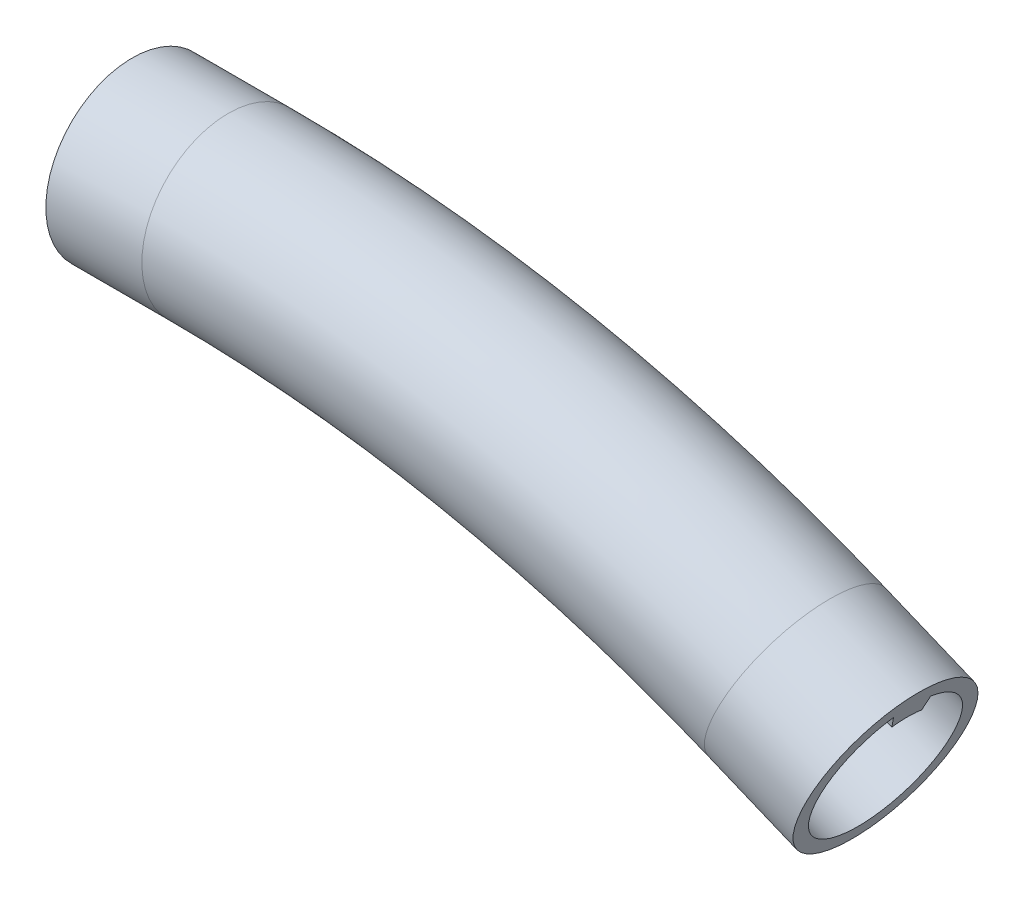
ISO-10303-21;
HEADER;
FILE_DESCRIPTION(('STEP AP214'),'2;1');
FILE_NAME('part.step','',(''),(''),'','','');
FILE_SCHEMA(('AUTOMOTIVE_DESIGN { 1 0 10303 214 1 1 1 1 }'));
ENDSEC;
DATA;
#1=APPLICATION_CONTEXT('core data for automotive mechanical design processes');
#2=APPLICATION_PROTOCOL_DEFINITION('international standard','automotive_design',2000,#1);
#3=PRODUCT_CONTEXT('',#1,'mechanical');
#4=PRODUCT('Part','Part','',(#3));
#5=PRODUCT_RELATED_PRODUCT_CATEGORY('part','',(#4));
#6=PRODUCT_DEFINITION_FORMATION('','',#4);
#7=PRODUCT_DEFINITION_CONTEXT('part definition',#1,'design');
#8=PRODUCT_DEFINITION('design','',#6,#7);
#9=PRODUCT_DEFINITION_SHAPE('','',#8);
#10=(LENGTH_UNIT() NAMED_UNIT(*) SI_UNIT(.MILLI.,.METRE.));
#11=(NAMED_UNIT(*) PLANE_ANGLE_UNIT() SI_UNIT($,.RADIAN.));
#12=(NAMED_UNIT(*) SI_UNIT($,.STERADIAN.) SOLID_ANGLE_UNIT());
#13=UNCERTAINTY_MEASURE_WITH_UNIT(LENGTH_MEASURE(1.E-05),#10,'distance_accuracy_value','');
#14=(GEOMETRIC_REPRESENTATION_CONTEXT(3) GLOBAL_UNCERTAINTY_ASSIGNED_CONTEXT((#13)) GLOBAL_UNIT_ASSIGNED_CONTEXT((#10,
#11,#12)) REPRESENTATION_CONTEXT('',''));
#15=CARTESIAN_POINT('',(0.,0.,0.));
#16=DIRECTION('',(0.,0.,1.));
#17=DIRECTION('',(1.,0.,0.));
#18=AXIS2_PLACEMENT_3D('',#15,#16,#17);
#19=CARTESIAN_POINT('',(10.0000000000002,-54.7598408980645,0.));
#20=DIRECTION('',(0.,0.,-1.));
#21=DIRECTION('',(-1.,0.,0.));
#22=AXIS2_PLACEMENT_3D('',#19,#20,#21);
#23=TOROIDAL_SURFACE('',#22,154.759840898064,7.50000000000001);
#24=CARTESIAN_POINT('',(66.7196715367739,89.2314338916071,0.));
#25=DIRECTION('',(-0.930417567982085,0.366501226724142,0.));
#26=DIRECTION('',(-0.366501226724142,-0.930417567982086,0.));
#27=AXIS2_PLACEMENT_3D('',#24,#25,#26);
#28=CIRCLE('',#27,7.50000000000001);
#29=CARTESIAN_POINT('',(64.7039147898143,84.1141372676965,-5.09901951359279));
#30=VERTEX_POINT('',#29);
#31=CARTESIAN_POINT('',(64.7039147898143,84.1141372676965,5.09901951359279));
#32=VERTEX_POINT('',#31);
#33=EDGE_CURVE('E159',#30,#32,#28,.T.);
#34=ORIENTED_EDGE('',*,*,#33,.T.);
#35=CARTESIAN_POINT('',(10.0000000000002,-54.7598408980645,5.09901951359279));
#36=DIRECTION('',(0.,0.,-1.));
#37=DIRECTION('',(-1.,0.,0.));
#38=AXIS2_PLACEMENT_3D('',#35,#36,#37);
#39=CIRCLE('',#38,149.259840898064);
#40=CARTESIAN_POINT('',(61.0498721767229,85.4985301735253,5.09901951359277));
#41=VERTEX_POINT('',#40);
#42=EDGE_CURVE('E163',#32,#41,#39,.F.);
#43=ORIENTED_EDGE('',*,*,#42,.T.);
#44=CARTESIAN_POINT('',(62.9309829650141,90.6668395878478,0.));
#45=DIRECTION('',(0.939692620785908,-0.34202014332567,0.));
#46=DIRECTION('',(0.34202014332567,0.939692620785908,0.));
#47=AXIS2_PLACEMENT_3D('',#44,#45,#46);
#48=CIRCLE('',#47,7.50000000000001);
#49=CARTESIAN_POINT('',(61.0498721767229,85.4985301735253,-5.09901951359278));
#50=VERTEX_POINT('',#49);
#51=EDGE_CURVE('E160',#41,#50,#48,.T.);
#52=ORIENTED_EDGE('',*,*,#51,.T.);
#53=CARTESIAN_POINT('',(10.0000000000002,-54.7598408980645,-5.09901951359279));
#54=DIRECTION('',(0.,0.,1.));
#55=DIRECTION('',(1.,0.,0.));
#56=AXIS2_PLACEMENT_3D('',#53,#54,#55);
#57=CIRCLE('',#56,149.259840898064);
#58=EDGE_CURVE('E142',#30,#50,#57,.T.);
#59=ORIENTED_EDGE('',*,*,#58,.F.);
#60=EDGE_LOOP('',(#34,#43,#52,#59));
#61=FACE_BOUND('',#60,.T.);
#62=CARTESIAN_POINT('',(69.2240271071456,88.2196085623608,0.));
#63=DIRECTION('',(0.923879532511289,-0.382683432365084,0.));
#64=DIRECTION('',(0.,0.,-1.));
#65=AXIS2_PLACEMENT_3D('',#62,#63,#64);
#66=CIRCLE('',#65,7.50000000000001);
#67=CARTESIAN_POINT('',(69.2240271071456,88.2196085623608,-7.50000000000001));
#68=VERTEX_POINT('',#67);
#69=EDGE_CURVE('E248',#68,#68,#66,.T.);
#70=ORIENTED_EDGE('',*,*,#69,.T.);
#71=EDGE_LOOP('',(#70));
#72=FACE_BOUND('',#71,.T.);
#73=CARTESIAN_POINT('',(10.,99.9999999999999,0.));
#74=DIRECTION('',(1.,0.,0.));
#75=DIRECTION('',(0.,0.,-1.));
#76=AXIS2_PLACEMENT_3D('',#73,#74,#75);
#77=CIRCLE('',#76,7.50000000000001);
#78=CARTESIAN_POINT('',(10.,99.9999999999999,-7.50000000000001));
#79=VERTEX_POINT('',#78);
#80=EDGE_CURVE('E241',#79,#79,#77,.T.);
#81=ORIENTED_EDGE('',*,*,#80,.F.);
#82=EDGE_LOOP('',(#81));
#83=FACE_BOUND('',#82,.T.);
#84=CARTESIAN_POINT('',(38.1765703783423,97.4133802563441,0.));
#85=DIRECTION('',(0.983286234150631,-0.182066421203555,0.));
#86=DIRECTION('',(0.182066421203555,0.983286234150631,0.));
#87=AXIS2_PLACEMENT_3D('',#84,#85,#86);
#88=CIRCLE('',#87,7.50000000000001);
#89=CARTESIAN_POINT('',(39.1779356949622,102.821454544173,-5.0990195135927));
#90=VERTEX_POINT('',#89);
#91=CARTESIAN_POINT('',(39.1779356949622,102.821454544173,5.0990195135927));
#92=VERTEX_POINT('',#91);
#93=EDGE_CURVE('E174',#90,#92,#88,.T.);
#94=ORIENTED_EDGE('',*,*,#93,.T.);
#95=CARTESIAN_POINT('',(10.0000000000002,-54.7598408980645,5.0990195135927));
#96=DIRECTION('',(0.,0.,-1.));
#97=DIRECTION('',(-1.,0.,0.));
#98=AXIS2_PLACEMENT_3D('',#95,#96,#97);
#99=CIRCLE('',#98,160.259840898065);
#100=CARTESIAN_POINT('',(43.2929345702146,102.003666055488,5.09901951359283));
#101=VERTEX_POINT('',#100);
#102=EDGE_CURVE('E178',#92,#101,#99,.T.);
#103=ORIENTED_EDGE('',*,*,#102,.T.);
#104=CARTESIAN_POINT('',(42.1503455154017,96.6236576677783,0.));
#105=DIRECTION('',(-0.978183343219863,0.207743464511429,0.));
#106=DIRECTION('',(-0.207743464511429,-0.978183343219863,0.));
#107=AXIS2_PLACEMENT_3D('',#104,#105,#106);
#108=CIRCLE('',#107,7.50000000000001);
#109=CARTESIAN_POINT('',(43.2929345702146,102.003666055488,-5.09901951359283));
#110=VERTEX_POINT('',#109);
#111=EDGE_CURVE('E175',#101,#110,#108,.T.);
#112=ORIENTED_EDGE('',*,*,#111,.T.);
#113=CARTESIAN_POINT('',(10.0000000000002,-54.7598408980645,-5.0990195135927));
#114=DIRECTION('',(0.,0.,1.));
#115=DIRECTION('',(1.,0.,0.));
#116=AXIS2_PLACEMENT_3D('',#113,#114,#115);
#117=CIRCLE('',#116,160.259840898065);
#118=EDGE_CURVE('E162',#90,#110,#117,.F.);
#119=ORIENTED_EDGE('',*,*,#118,.F.);
#120=EDGE_LOOP('',(#94,#103,#112,#119));
#121=FACE_BOUND('',#120,.T.);
#122=CARTESIAN_POINT('',(16.7505294487302,99.8527029234381,0.));
#123=DIRECTION('',(-0.999048221581858,0.043619387365333,0.));
#124=DIRECTION('',(-0.043619387365333,-0.999048221581858,0.));
#125=AXIS2_PLACEMENT_3D('',#122,#123,#124);
#126=CIRCLE('',#125,7.50000000000001);
#127=CARTESIAN_POINT('',(16.5106228182203,94.3579377047379,-5.09901951359279));
#128=VERTEX_POINT('',#127);
#129=CARTESIAN_POINT('',(16.5106228182203,94.3579377047378,5.09901951359279));
#130=VERTEX_POINT('',#129);
#131=EDGE_CURVE('E53',#128,#130,#126,.T.);
#132=ORIENTED_EDGE('',*,*,#131,.T.);
#133=CARTESIAN_POINT('',(10.0000000000002,-54.7598408980645,5.09901951359279));
#134=DIRECTION('',(0.,0.,-1.));
#135=DIRECTION('',(-1.,0.,0.));
#136=AXIS2_PLACEMENT_3D('',#133,#134,#135);
#137=CIRCLE('',#136,149.259840898064);
#138=CARTESIAN_POINT('',(12.6049434081168,94.4772670032749,5.09901951359279));
#139=VERTEX_POINT('',#138);
#140=EDGE_CURVE('E130',#130,#139,#137,.F.);
#141=ORIENTED_EDGE('',*,*,#140,.T.);
#142=CARTESIAN_POINT('',(12.7009316435218,99.9764293266351,0.));
#143=DIRECTION('',(0.999847695156391,-0.0174524064372789,0.));
#144=DIRECTION('',(0.0174524064372789,0.999847695156391,0.));
#145=AXIS2_PLACEMENT_3D('',#142,#143,#144);
#146=CIRCLE('',#145,7.50000000000001);
#147=CARTESIAN_POINT('',(12.6049434081168,94.4772670032749,-5.0990195135928));
#148=VERTEX_POINT('',#147);
#149=EDGE_CURVE('E132',#139,#148,#146,.T.);
#150=ORIENTED_EDGE('',*,*,#149,.T.);
#151=CARTESIAN_POINT('',(10.0000000000002,-54.7598408980645,-5.09901951359279));
#152=DIRECTION('',(0.,0.,1.));
#153=DIRECTION('',(1.,0.,0.));
#154=AXIS2_PLACEMENT_3D('',#151,#152,#153);
#155=CIRCLE('',#154,149.259840898064);
#156=EDGE_CURVE('E49',#128,#148,#155,.T.);
#157=ORIENTED_EDGE('',*,*,#156,.F.);
#158=EDGE_LOOP('',(#132,#141,#150,#157));
#159=FACE_BOUND('',#158,.T.);
#160=ADVANCED_FACE('F34',(#61,#72,#83,#121,#159),#23,.F.);
#161=CARTESIAN_POINT('',(69.2240271071456,88.2196085623608,0.));
#162=DIRECTION('',(0.923879532511289,-0.382683432365084,0.));
#163=DIRECTION('',(0.382683432365084,0.923879532511289,0.));
#164=AXIS2_PLACEMENT_3D('',#161,#162,#163);
#165=CYLINDRICAL_SURFACE('',#164,9.);
#166=CARTESIAN_POINT('',(69.2240271071456,88.2196085623608,0.));
#167=DIRECTION('',(0.923879532511289,-0.382683432365084,0.));
#168=DIRECTION('',(0.,0.,-1.));
#169=AXIS2_PLACEMENT_3D('',#166,#167,#168);
#170=CIRCLE('',#169,9.);
#171=CARTESIAN_POINT('',(72.6681779984314,96.5345243549625,0.));
#172=VERTEX_POINT('',#171);
#173=EDGE_CURVE('E255',#172,#172,#170,.T.);
#174=ORIENTED_EDGE('',*,*,#173,.T.);
#175=EDGE_LOOP('',(#174));
#176=FACE_BOUND('',#175,.T.);
#177=CARTESIAN_POINT('',(78.4628224322585,84.39277423871,0.));
#178=DIRECTION('',(0.923879532511289,-0.382683432365084,0.));
#179=DIRECTION('',(0.,0.,-1.));
#180=AXIS2_PLACEMENT_3D('',#177,#178,#179);
#181=CIRCLE('',#180,9.);
#182=CARTESIAN_POINT('',(78.4628224322585,84.39277423871,-9.));
#183=VERTEX_POINT('',#182);
#184=EDGE_CURVE('E11',#183,#183,#181,.T.);
#185=ORIENTED_EDGE('',*,*,#184,.F.);
#186=EDGE_LOOP('',(#185));
#187=FACE_BOUND('',#186,.T.);
#188=ADVANCED_FACE('F36',(#176,#187),#165,.T.);
#189=CARTESIAN_POINT('',(69.2240271071456,88.2196085623608,0.));
#190=DIRECTION('',(0.923879532511289,-0.382683432365084,0.));
#191=DIRECTION('',(0.382683432365084,0.923879532511289,0.));
#192=AXIS2_PLACEMENT_3D('',#189,#190,#191);
#193=CYLINDRICAL_SURFACE('',#192,7.50000000000001);
#194=ORIENTED_EDGE('',*,*,#69,.F.);
#195=EDGE_LOOP('',(#194));
#196=FACE_BOUND('',#195,.T.);
#197=CARTESIAN_POINT('',(73.8434247697021,86.3061914005354,0.));
#198=DIRECTION('',(0.923879532511289,-0.382683432365084,0.));
#199=DIRECTION('',(0.382683432365084,0.923879532511289,0.));
#200=AXIS2_PLACEMENT_3D('',#197,#198,#199);
#201=CIRCLE('',#200,7.50000000000002);
#202=CARTESIAN_POINT('',(76.61575334931,92.9991846567793,-1.94114283826889));
#203=VERTEX_POINT('',#202);
#204=CARTESIAN_POINT('',(76.61575334931,92.9991846567793,1.94114283826886));
#205=VERTEX_POINT('',#204);
#206=EDGE_CURVE('E218',#203,#205,#201,.T.);
#207=ORIENTED_EDGE('',*,*,#206,.T.);
#208=DIRECTION('',(0.923879532511289,-0.382683432365084,0.));
#209=VECTOR('',#208,1.);
#210=CARTESIAN_POINT('',(76.61575334931,92.9991846567794,1.94114283826887));
#211=LINE('',#210,#209);
#212=CARTESIAN_POINT('',(81.2351510118664,91.085767494954,1.94114283826887));
#213=VERTEX_POINT('',#212);
#214=EDGE_CURVE('E234',#205,#213,#211,.T.);
#215=ORIENTED_EDGE('',*,*,#214,.T.);
#216=CARTESIAN_POINT('',(78.4628224322585,84.39277423871,0.));
#217=DIRECTION('',(0.923879532511289,-0.382683432365084,0.));
#218=DIRECTION('',(0.,0.,-1.));
#219=AXIS2_PLACEMENT_3D('',#216,#217,#218);
#220=CIRCLE('',#219,7.50000000000001);
#221=CARTESIAN_POINT('',(81.2351510118664,91.0857674949539,-1.94114283826889));
#222=VERTEX_POINT('',#221);
#223=EDGE_CURVE('E42',#213,#222,#220,.T.);
#224=ORIENTED_EDGE('',*,*,#223,.T.);
#225=DIRECTION('',(0.923879532511289,-0.382683432365084,0.));
#226=VECTOR('',#225,1.);
#227=CARTESIAN_POINT('',(76.61575334931,92.9991846567794,-1.9411428382689));
#228=LINE('',#227,#226);
#229=EDGE_CURVE('E237',#203,#222,#228,.T.);
#230=ORIENTED_EDGE('',*,*,#229,.F.);
#231=EDGE_LOOP('',(#207,#215,#224,#230));
#232=FACE_BOUND('',#231,.T.);
#233=ADVANCED_FACE('F258',(#196,#232),#193,.F.);
#234=CARTESIAN_POINT('',(10.0000000000002,-54.7598408980645,0.));
#235=DIRECTION('',(0.,0.,-1.));
#236=DIRECTION('',(-1.,0.,0.));
#237=AXIS2_PLACEMENT_3D('',#234,#235,#236);
#238=TOROIDAL_SURFACE('',#237,154.759840898064,9.);
#239=CARTESIAN_POINT('',(10.,99.9999999999999,0.));
#240=DIRECTION('',(1.,0.,0.));
#241=DIRECTION('',(0.,0.,-1.));
#242=AXIS2_PLACEMENT_3D('',#239,#240,#241);
#243=CIRCLE('',#242,9.);
#244=CARTESIAN_POINT('',(9.99999999999999,109.,0.));
#245=VERTEX_POINT('',#244);
#246=EDGE_CURVE('E244',#245,#245,#243,.T.);
#247=CARTESIAN_POINT('',(10.0000000000002,-54.7598408980645,0.));
#248=DIRECTION('',(0.,0.,-1.));
#249=DIRECTION('',(-1.,0.,0.));
#250=AXIS2_PLACEMENT_3D('',#247,#248,#249);
#251=CIRCLE('',#250,163.759840898064);
#252=EDGE_CURVE('',#245,#172,#251,.T.);
#253=ORIENTED_EDGE('',*,*,#246,.T.);
#254=ORIENTED_EDGE('',*,*,#173,.F.);
#255=ORIENTED_EDGE('',*,*,#252,.T.);
#256=ORIENTED_EDGE('',*,*,#252,.F.);
#257=EDGE_LOOP('',(#253,#255,#254,#256));
#258=FACE_BOUND('',#257,.T.);
#259=ADVANCED_FACE('F301',(#258),#238,.T.);
#260=CARTESIAN_POINT('',(10.,99.9999999999999,0.));
#261=DIRECTION('',(-1.,0.,0.));
#262=DIRECTION('',(0.,-1.,0.));
#263=AXIS2_PLACEMENT_3D('',#260,#261,#262);
#264=CYLINDRICAL_SURFACE('',#263,7.50000000000001);
#265=DIRECTION('',(-1.,0.,0.));
#266=VECTOR('',#265,1.);
#267=CARTESIAN_POINT('',(5.,107.244443697168,-1.94114283826872));
#268=LINE('',#267,#266);
#269=CARTESIAN_POINT('',(5.,107.244443697168,-1.94114283826872));
#270=VERTEX_POINT('',#269);
#271=CARTESIAN_POINT('',(0.,107.244443697168,-1.94114283826872));
#272=VERTEX_POINT('',#271);
#273=EDGE_CURVE('E204',#270,#272,#268,.T.);
#274=ORIENTED_EDGE('',*,*,#273,.T.);
#275=CARTESIAN_POINT('',(0.,100.,0.));
#276=DIRECTION('',(1.,0.,0.));
#277=DIRECTION('',(0.,0.,-1.));
#278=AXIS2_PLACEMENT_3D('',#275,#276,#277);
#279=CIRCLE('',#278,7.50000000000001);
#280=CARTESIAN_POINT('',(0.,107.244443697168,1.94114283826869));
#281=VERTEX_POINT('',#280);
#282=EDGE_CURVE('E233',#281,#272,#279,.T.);
#283=ORIENTED_EDGE('',*,*,#282,.F.);
#284=DIRECTION('',(-1.,0.,0.));
#285=VECTOR('',#284,1.);
#286=CARTESIAN_POINT('',(5.,107.244443697168,1.94114283826868));
#287=LINE('',#286,#285);
#288=CARTESIAN_POINT('',(5.,107.244443697168,1.94114283826868));
#289=VERTEX_POINT('',#288);
#290=EDGE_CURVE('E207',#289,#281,#287,.T.);
#291=ORIENTED_EDGE('',*,*,#290,.F.);
#292=CARTESIAN_POINT('',(5.,100.000000000001,0.));
#293=DIRECTION('',(-1.,0.,0.));
#294=DIRECTION('',(0.,0.,1.));
#295=AXIS2_PLACEMENT_3D('',#292,#293,#294);
#296=CIRCLE('',#295,7.4999999999993);
#297=EDGE_CURVE('E188',#289,#270,#296,.T.);
#298=ORIENTED_EDGE('',*,*,#297,.T.);
#299=EDGE_LOOP('',(#274,#283,#291,#298));
#300=FACE_BOUND('',#299,.T.);
#301=ORIENTED_EDGE('',*,*,#80,.T.);
#302=EDGE_LOOP('',(#301));
#303=FACE_BOUND('',#302,.T.);
#304=ADVANCED_FACE('F299',(#300,#303),#264,.F.);
#305=CARTESIAN_POINT('',(10.,99.9999999999999,0.));
#306=DIRECTION('',(-1.,0.,0.));
#307=DIRECTION('',(0.,-1.,0.));
#308=AXIS2_PLACEMENT_3D('',#305,#306,#307);
#309=CYLINDRICAL_SURFACE('',#308,9.);
#310=ORIENTED_EDGE('',*,*,#246,.F.);
#311=EDGE_LOOP('',(#310));
#312=FACE_BOUND('',#311,.T.);
#313=CARTESIAN_POINT('',(0.,100.,0.));
#314=DIRECTION('',(1.,0.,0.));
#315=DIRECTION('',(0.,0.,-1.));
#316=AXIS2_PLACEMENT_3D('',#313,#314,#315);
#317=CIRCLE('',#316,9.);
#318=CARTESIAN_POINT('',(0.,100.,-9.));
#319=VERTEX_POINT('',#318);
#320=EDGE_CURVE('E245',#319,#319,#317,.T.);
#321=ORIENTED_EDGE('',*,*,#320,.T.);
#322=EDGE_LOOP('',(#321));
#323=FACE_BOUND('',#322,.T.);
#324=ADVANCED_FACE('F463',(#312,#323),#309,.T.);
#325=CARTESIAN_POINT('',(78.4628224322585,84.39277423871,0.));
#326=DIRECTION('',(0.923879532511289,-0.382683432365084,0.));
#327=DIRECTION('',(0.,0.,-1.));
#328=AXIS2_PLACEMENT_3D('',#325,#326,#327);
#329=PLANE('',#328);
#330=ORIENTED_EDGE('',*,*,#223,.F.);
#331=DIRECTION('',(-0.369643810614381,-0.892399100832527,-0.258819045102514));
#332=VECTOR('',#331,1.);
#333=CARTESIAN_POINT('',(80.6806852959448,89.7471688437052,1.5529142706151));
#334=LINE('',#333,#332);
#335=CARTESIAN_POINT('',(80.6806852959448,89.7471688437052,1.5529142706151));
#336=VERTEX_POINT('',#335);
#337=EDGE_CURVE('E215',#213,#336,#334,.T.);
#338=ORIENTED_EDGE('',*,*,#337,.T.);
#339=CARTESIAN_POINT('',(78.4628224322585,84.39277423871,0.));
#340=DIRECTION('',(-0.923879532511289,0.382683432365084,0.));
#341=DIRECTION('',(0.382683432365084,0.923879532511289,0.));
#342=AXIS2_PLACEMENT_3D('',#339,#340,#341);
#343=CIRCLE('',#342,6.00000000000002);
#344=CARTESIAN_POINT('',(80.6806852959448,89.7471688437052,-1.55291427061512));
#345=VERTEX_POINT('',#344);
#346=EDGE_CURVE('E203',#336,#345,#343,.T.);
#347=ORIENTED_EDGE('',*,*,#346,.T.);
#348=DIRECTION('',(0.369643810614376,0.892399100832527,-0.258819045102519));
#349=VECTOR('',#348,1.);
#350=CARTESIAN_POINT('',(81.2351510118664,91.085767494954,-1.9411428382689));
#351=LINE('',#350,#349);
#352=EDGE_CURVE('E226',#345,#222,#351,.T.);
#353=ORIENTED_EDGE('',*,*,#352,.T.);
#354=EDGE_LOOP('',(#330,#338,#347,#353));
#355=FACE_BOUND('',#354,.T.);
#356=ORIENTED_EDGE('',*,*,#184,.T.);
#357=EDGE_LOOP('',(#356));
#358=FACE_BOUND('',#357,.T.);
#359=ADVANCED_FACE('F267',(#355,#358),#329,.T.);
#360=CARTESIAN_POINT('',(0.,100.,0.));
#361=DIRECTION('',(1.,0.,0.));
#362=DIRECTION('',(0.,0.,-1.));
#363=AXIS2_PLACEMENT_3D('',#360,#361,#362);
#364=PLANE('',#363);
#365=ORIENTED_EDGE('',*,*,#282,.T.);
#366=DIRECTION('',(0.,-0.965925826289068,0.258819045102523));
#367=VECTOR('',#366,1.);
#368=CARTESIAN_POINT('',(0.,105.795554957734,-1.55291427061494));
#369=LINE('',#368,#367);
#370=CARTESIAN_POINT('',(0.,105.795554957734,-1.55291427061494));
#371=VERTEX_POINT('',#370);
#372=EDGE_CURVE('E185',#272,#371,#369,.T.);
#373=ORIENTED_EDGE('',*,*,#372,.T.);
#374=CARTESIAN_POINT('',(0.,100.000000000001,0.));
#375=DIRECTION('',(1.,0.,0.));
#376=DIRECTION('',(0.,0.,1.));
#377=AXIS2_PLACEMENT_3D('',#374,#375,#376);
#378=CIRCLE('',#377,5.9999999999993);
#379=CARTESIAN_POINT('',(0.,105.795554957734,1.55291427061491));
#380=VERTEX_POINT('',#379);
#381=EDGE_CURVE('E177',#371,#380,#378,.T.);
#382=ORIENTED_EDGE('',*,*,#381,.T.);
#383=DIRECTION('',(0.,0.96592582628907,0.258819045102514));
#384=VECTOR('',#383,1.);
#385=CARTESIAN_POINT('',(0.,107.244443697168,1.94114283826868));
#386=LINE('',#385,#384);
#387=EDGE_CURVE('E197',#380,#281,#386,.T.);
#388=ORIENTED_EDGE('',*,*,#387,.T.);
#389=EDGE_LOOP('',(#365,#373,#382,#388));
#390=FACE_BOUND('',#389,.T.);
#391=ORIENTED_EDGE('',*,*,#320,.F.);
#392=EDGE_LOOP('',(#391));
#393=FACE_BOUND('',#392,.T.);
#394=ADVANCED_FACE('F285',(#390,#393),#364,.F.);
#395=CARTESIAN_POINT('',(73.8434247697021,86.3061914005354,0.));
#396=DIRECTION('',(0.923879532511289,-0.382683432365084,0.));
#397=DIRECTION('',(0.382683432365084,0.923879532511289,0.));
#398=AXIS2_PLACEMENT_3D('',#395,#396,#397);
#399=CYLINDRICAL_SURFACE('',#398,6.00000000000002);
#400=ORIENTED_EDGE('',*,*,#346,.F.);
#401=DIRECTION('',(0.923879532511289,-0.382683432365084,0.));
#402=VECTOR('',#401,1.);
#403=CARTESIAN_POINT('',(76.0612876333884,91.6605860055306,1.5529142706151));
#404=LINE('',#403,#402);
#405=CARTESIAN_POINT('',(76.0612876333884,91.6605860055306,1.5529142706151));
#406=VERTEX_POINT('',#405);
#407=EDGE_CURVE('E231',#406,#336,#404,.T.);
#408=ORIENTED_EDGE('',*,*,#407,.F.);
#409=CARTESIAN_POINT('',(73.8434247697021,86.3061914005354,0.));
#410=DIRECTION('',(-0.923879532511289,0.382683432365084,0.));
#411=DIRECTION('',(0.382683432365084,0.923879532511289,0.));
#412=AXIS2_PLACEMENT_3D('',#409,#410,#411);
#413=CIRCLE('',#412,6.00000000000002);
#414=CARTESIAN_POINT('',(76.0612876333884,91.6605860055306,-1.55291427061512));
#415=VERTEX_POINT('',#414);
#416=EDGE_CURVE('E211',#406,#415,#413,.T.);
#417=ORIENTED_EDGE('',*,*,#416,.T.);
#418=DIRECTION('',(0.923879532511289,-0.382683432365084,0.));
#419=VECTOR('',#418,1.);
#420=CARTESIAN_POINT('',(76.0612876333884,91.6605860055306,-1.55291427061512));
#421=LINE('',#420,#419);
#422=EDGE_CURVE('E223',#415,#345,#421,.T.);
#423=ORIENTED_EDGE('',*,*,#422,.T.);
#424=EDGE_LOOP('',(#400,#408,#417,#423));
#425=FACE_BOUND('',#424,.T.);
#426=ADVANCED_FACE('F271',(#425),#399,.F.);
#427=CARTESIAN_POINT('',(76.0612876333884,91.6605860055306,1.5529142706151));
#428=DIRECTION('',(-0.0990457605412834,-0.239117618394328,0.96592582628907));
#429=DIRECTION('',(0.,-0.970698869480123,-0.24029919847975));
#430=AXIS2_PLACEMENT_3D('',#427,#428,#429);
#431=PLANE('',#430);
#432=ORIENTED_EDGE('',*,*,#337,.F.);
#433=ORIENTED_EDGE('',*,*,#214,.F.);
#434=DIRECTION('',(-0.369643810614381,-0.892399100832527,-0.258819045102514));
#435=VECTOR('',#434,1.);
#436=CARTESIAN_POINT('',(76.0612876333884,91.6605860055306,1.5529142706151));
#437=LINE('',#436,#435);
#438=EDGE_CURVE('E220',#205,#406,#437,.T.);
#439=ORIENTED_EDGE('',*,*,#438,.T.);
#440=ORIENTED_EDGE('',*,*,#407,.T.);
#441=EDGE_LOOP('',(#432,#433,#439,#440));
#442=FACE_BOUND('',#441,.T.);
#443=ADVANCED_FACE('F277',(#442),#431,.T.);
#444=CARTESIAN_POINT('',(76.61575334931,92.9991846567794,-1.9411428382689));
#445=DIRECTION('',(-0.0990457605412856,-0.239117618394334,-0.965925826289069));
#446=DIRECTION('',(0.,0.970698869480122,-0.240299198479756));
#447=AXIS2_PLACEMENT_3D('',#444,#445,#446);
#448=PLANE('',#447);
#449=ORIENTED_EDGE('',*,*,#352,.F.);
#450=ORIENTED_EDGE('',*,*,#422,.F.);
#451=DIRECTION('',(0.369643810614376,0.892399100832527,-0.258819045102519));
#452=VECTOR('',#451,1.);
#453=CARTESIAN_POINT('',(76.61575334931,92.9991846567794,-1.9411428382689));
#454=LINE('',#453,#452);
#455=EDGE_CURVE('E214',#415,#203,#454,.T.);
#456=ORIENTED_EDGE('',*,*,#455,.T.);
#457=ORIENTED_EDGE('',*,*,#229,.T.);
#458=EDGE_LOOP('',(#449,#450,#456,#457));
#459=FACE_BOUND('',#458,.T.);
#460=ADVANCED_FACE('F265',(#459),#448,.T.);
#461=CARTESIAN_POINT('',(73.8434247697021,86.3061914005354,0.));
#462=DIRECTION('',(0.923879532511289,-0.382683432365084,0.));
#463=DIRECTION('',(0.382683432365084,0.923879532511289,0.));
#464=AXIS2_PLACEMENT_3D('',#461,#462,#463);
#465=PLANE('',#464);
#466=ORIENTED_EDGE('',*,*,#416,.F.);
#467=ORIENTED_EDGE('',*,*,#438,.F.);
#468=ORIENTED_EDGE('',*,*,#206,.F.);
#469=ORIENTED_EDGE('',*,*,#455,.F.);
#470=EDGE_LOOP('',(#466,#467,#468,#469));
#471=FACE_BOUND('',#470,.T.);
#472=ADVANCED_FACE('F274',(#471),#465,.F.);
#473=CARTESIAN_POINT('',(5.,100.000000000001,0.));
#474=DIRECTION('',(-1.,0.,0.));
#475=DIRECTION('',(0.,0.,1.));
#476=AXIS2_PLACEMENT_3D('',#473,#474,#475);
#477=CYLINDRICAL_SURFACE('',#476,5.9999999999993);
#478=ORIENTED_EDGE('',*,*,#381,.F.);
#479=DIRECTION('',(-1.,0.,0.));
#480=VECTOR('',#479,1.);
#481=CARTESIAN_POINT('',(5.,105.795554957734,-1.55291427061494));
#482=LINE('',#481,#480);
#483=CARTESIAN_POINT('',(5.,105.795554957734,-1.55291427061494));
#484=VERTEX_POINT('',#483);
#485=EDGE_CURVE('E201',#484,#371,#482,.T.);
#486=ORIENTED_EDGE('',*,*,#485,.F.);
#487=CARTESIAN_POINT('',(5.,100.000000000001,0.));
#488=DIRECTION('',(1.,0.,0.));
#489=DIRECTION('',(0.,0.,1.));
#490=AXIS2_PLACEMENT_3D('',#487,#488,#489);
#491=CIRCLE('',#490,5.9999999999993);
#492=CARTESIAN_POINT('',(5.,105.795554957734,1.55291427061491));
#493=VERTEX_POINT('',#492);
#494=EDGE_CURVE('E181',#484,#493,#491,.T.);
#495=ORIENTED_EDGE('',*,*,#494,.T.);
#496=DIRECTION('',(-1.,0.,0.));
#497=VECTOR('',#496,1.);
#498=CARTESIAN_POINT('',(5.,105.795554957734,1.55291427061491));
#499=LINE('',#498,#497);
#500=EDGE_CURVE('E194',#493,#380,#499,.T.);
#501=ORIENTED_EDGE('',*,*,#500,.T.);
#502=EDGE_LOOP('',(#478,#486,#495,#501));
#503=FACE_BOUND('',#502,.T.);
#504=ADVANCED_FACE('F432',(#503),#477,.F.);
#505=CARTESIAN_POINT('',(5.,105.795554957734,-1.55291427061494));
#506=DIRECTION('',(0.,-0.258819045102523,-0.965925826289068));
#507=DIRECTION('',(0.,0.965925826289068,-0.258819045102523));
#508=AXIS2_PLACEMENT_3D('',#505,#506,#507);
#509=PLANE('',#508);
#510=ORIENTED_EDGE('',*,*,#372,.F.);
#511=ORIENTED_EDGE('',*,*,#273,.F.);
#512=DIRECTION('',(0.,-0.965925826289068,0.258819045102523));
#513=VECTOR('',#512,1.);
#514=CARTESIAN_POINT('',(5.,105.795554957734,-1.55291427061494));
#515=LINE('',#514,#513);
#516=EDGE_CURVE('E191',#270,#484,#515,.T.);
#517=ORIENTED_EDGE('',*,*,#516,.T.);
#518=ORIENTED_EDGE('',*,*,#485,.T.);
#519=EDGE_LOOP('',(#510,#511,#517,#518));
#520=FACE_BOUND('',#519,.T.);
#521=ADVANCED_FACE('F422',(#520),#509,.T.);
#522=CARTESIAN_POINT('',(5.,107.244443697168,1.94114283826868));
#523=DIRECTION('',(0.,-0.258819045102514,0.96592582628907));
#524=DIRECTION('',(0.,-0.96592582628907,-0.258819045102514));
#525=AXIS2_PLACEMENT_3D('',#522,#523,#524);
#526=PLANE('',#525);
#527=ORIENTED_EDGE('',*,*,#387,.F.);
#528=ORIENTED_EDGE('',*,*,#500,.F.);
#529=DIRECTION('',(0.,0.96592582628907,0.258819045102514));
#530=VECTOR('',#529,1.);
#531=CARTESIAN_POINT('',(5.,107.244443697168,1.94114283826868));
#532=LINE('',#531,#530);
#533=EDGE_CURVE('E184',#493,#289,#532,.T.);
#534=ORIENTED_EDGE('',*,*,#533,.T.);
#535=ORIENTED_EDGE('',*,*,#290,.T.);
#536=EDGE_LOOP('',(#527,#528,#534,#535));
#537=FACE_BOUND('',#536,.T.);
#538=ADVANCED_FACE('F333',(#537),#526,.T.);
#539=CARTESIAN_POINT('',(5.,100.000000000001,0.));
#540=DIRECTION('',(-1.,0.,0.));
#541=DIRECTION('',(0.,0.,1.));
#542=AXIS2_PLACEMENT_3D('',#539,#540,#541);
#543=PLANE('',#542);
#544=ORIENTED_EDGE('',*,*,#494,.F.);
#545=ORIENTED_EDGE('',*,*,#516,.F.);
#546=ORIENTED_EDGE('',*,*,#297,.F.);
#547=ORIENTED_EDGE('',*,*,#533,.F.);
#548=EDGE_LOOP('',(#544,#545,#546,#547));
#549=FACE_BOUND('',#548,.T.);
#550=ADVANCED_FACE('F324',(#549),#543,.F.);
#551=CARTESIAN_POINT('',(39.5420685373693,104.788027012474,500000.));
#552=DIRECTION('',(0.983286234150631,-0.182066421203555,0.));
#553=DIRECTION('',(0.182066421203555,0.983286234150631,0.));
#554=AXIS2_PLACEMENT_3D('',#551,#552,#553);
#555=PLANE('',#554);
#556=ORIENTED_EDGE('',*,*,#93,.F.);
#557=DIRECTION('',(0.,0.,-1.));
#558=VECTOR('',#557,1.);
#559=CARTESIAN_POINT('',(39.1779356949622,102.821454544173,500000.));
#560=LINE('',#559,#558);
#561=EDGE_CURVE('E171',#92,#90,#560,.T.);
#562=ORIENTED_EDGE('',*,*,#561,.F.);
#563=EDGE_LOOP('',(#556,#562));
#564=FACE_BOUND('',#563,.T.);
#565=ADVANCED_FACE('F322',(#564),#555,.F.);
#566=CARTESIAN_POINT('',(9.99999999999985,-54.7598408980645,500000.));
#567=DIRECTION('',(0.,0.,-1.));
#568=DIRECTION('',(-1.,0.,0.));
#569=AXIS2_PLACEMENT_3D('',#566,#567,#568);
#570=CYLINDRICAL_SURFACE('',#569,160.259840898065);
#571=ORIENTED_EDGE('',*,*,#102,.F.);
#572=ORIENTED_EDGE('',*,*,#561,.T.);
#573=ORIENTED_EDGE('',*,*,#118,.T.);
#574=DIRECTION('',(0.,0.,-1.));
#575=VECTOR('',#574,1.);
#576=CARTESIAN_POINT('',(43.2929345702139,102.003666055488,500000.));
#577=LINE('',#576,#575);
#578=EDGE_CURVE('E168',#101,#110,#577,.T.);
#579=ORIENTED_EDGE('',*,*,#578,.F.);
#580=EDGE_LOOP('',(#571,#572,#573,#579));
#581=FACE_BOUND('',#580,.T.);
#582=ADVANCED_FACE('F321',(#581),#570,.F.);
#583=CARTESIAN_POINT('',(43.7084214992367,103.960032741927,500000.));
#584=DIRECTION('',(-0.978183343219863,0.207743464511429,0.));
#585=DIRECTION('',(-0.207743464511429,-0.978183343219863,0.));
#586=AXIS2_PLACEMENT_3D('',#583,#584,#585);
#587=PLANE('',#586);
#588=ORIENTED_EDGE('',*,*,#111,.F.);
#589=ORIENTED_EDGE('',*,*,#578,.T.);
#590=EDGE_LOOP('',(#588,#589));
#591=FACE_BOUND('',#590,.T.);
#592=ADVANCED_FACE('F331',(#591),#587,.F.);
#593=CARTESIAN_POINT('',(63.9709123363661,82.2533021317323,500000.));
#594=DIRECTION('',(-0.930417567982085,0.366501226724142,0.));
#595=DIRECTION('',(-0.366501226724142,-0.930417567982086,0.));
#596=AXIS2_PLACEMENT_3D('',#593,#594,#595);
#597=PLANE('',#596);
#598=ORIENTED_EDGE('',*,*,#33,.F.);
#599=DIRECTION('',(0.,0.,-1.));
#600=VECTOR('',#599,1.);
#601=CARTESIAN_POINT('',(64.7039147898143,84.1141372676965,500000.));
#602=LINE('',#601,#600);
#603=EDGE_CURVE('E156',#32,#30,#602,.T.);
#604=ORIENTED_EDGE('',*,*,#603,.F.);
#605=EDGE_LOOP('',(#598,#604));
#606=FACE_BOUND('',#605,.T.);
#607=ADVANCED_FACE('F347',(#606),#597,.F.);
#608=CARTESIAN_POINT('',(10.0000000000002,-54.7598408980645,500000.));
#609=DIRECTION('',(0.,0.,-1.));
#610=DIRECTION('',(-1.,0.,0.));
#611=AXIS2_PLACEMENT_3D('',#608,#609,#610);
#612=CYLINDRICAL_SURFACE('',#611,149.259840898064);
#613=ORIENTED_EDGE('',*,*,#42,.F.);
#614=ORIENTED_EDGE('',*,*,#603,.T.);
#615=ORIENTED_EDGE('',*,*,#58,.T.);
#616=DIRECTION('',(0.,0.,-1.));
#617=VECTOR('',#616,1.);
#618=CARTESIAN_POINT('',(61.0498721767228,85.4985301735254,500000.));
#619=LINE('',#618,#617);
#620=EDGE_CURVE('E153',#41,#50,#619,.T.);
#621=ORIENTED_EDGE('',*,*,#620,.F.);
#622=EDGE_LOOP('',(#613,#614,#615,#621));
#623=FACE_BOUND('',#622,.T.);
#624=ADVANCED_FACE('F338',(#623),#612,.T.);
#625=CARTESIAN_POINT('',(60.3658318900714,83.6191449319535,500000.));
#626=DIRECTION('',(0.939692620785908,-0.34202014332567,0.));
#627=DIRECTION('',(0.34202014332567,0.939692620785908,0.));
#628=AXIS2_PLACEMENT_3D('',#625,#626,#627);
#629=PLANE('',#628);
#630=ORIENTED_EDGE('',*,*,#51,.F.);
#631=ORIENTED_EDGE('',*,*,#620,.T.);
#632=EDGE_LOOP('',(#630,#631));
#633=FACE_BOUND('',#632,.T.);
#634=ADVANCED_FACE('F326',(#633),#629,.F.);
#635=CARTESIAN_POINT('',(16.4233840434896,92.3598412615741,500000.));
#636=DIRECTION('',(-0.999048221581858,0.043619387365333,0.));
#637=DIRECTION('',(-0.043619387365333,-0.999048221581858,0.));
#638=AXIS2_PLACEMENT_3D('',#635,#636,#637);
#639=PLANE('',#638);
#640=ORIENTED_EDGE('',*,*,#131,.F.);
#641=DIRECTION('',(0.,0.,-1.));
#642=VECTOR('',#641,1.);
#643=CARTESIAN_POINT('',(16.5106228182203,94.3579377047378,500000.));
#644=LINE('',#643,#642);
#645=EDGE_CURVE('E145',#130,#128,#644,.T.);
#646=ORIENTED_EDGE('',*,*,#645,.F.);
#647=EDGE_LOOP('',(#640,#646));
#648=FACE_BOUND('',#647,.T.);
#649=ADVANCED_FACE('F337',(#648),#639,.F.);
#650=CARTESIAN_POINT('',(10.0000000000002,-54.7598408980645,500000.));
#651=DIRECTION('',(0.,0.,-1.));
#652=DIRECTION('',(-1.,0.,0.));
#653=AXIS2_PLACEMENT_3D('',#650,#651,#652);
#654=CYLINDRICAL_SURFACE('',#653,149.259840898064);
#655=ORIENTED_EDGE('',*,*,#140,.F.);
#656=ORIENTED_EDGE('',*,*,#645,.T.);
#657=ORIENTED_EDGE('',*,*,#156,.T.);
#658=DIRECTION('',(0.,0.,-1.));
#659=VECTOR('',#658,1.);
#660=CARTESIAN_POINT('',(12.6049434081165,94.4772670032749,500000.));
#661=LINE('',#660,#659);
#662=EDGE_CURVE('E141',#139,#148,#661,.T.);
#663=ORIENTED_EDGE('',*,*,#662,.F.);
#664=EDGE_LOOP('',(#655,#656,#657,#663));
#665=FACE_BOUND('',#664,.T.);
#666=ADVANCED_FACE('F144',(#665),#654,.T.);
#667=CARTESIAN_POINT('',(12.5700385952419,92.4775716129621,500000.));
#668=DIRECTION('',(0.999847695156391,-0.0174524064372789,0.));
#669=DIRECTION('',(0.0174524064372789,0.999847695156391,0.));
#670=AXIS2_PLACEMENT_3D('',#667,#668,#669);
#671=PLANE('',#670);
#672=ORIENTED_EDGE('',*,*,#149,.F.);
#673=ORIENTED_EDGE('',*,*,#662,.T.);
#674=EDGE_LOOP('',(#672,#673));
#675=FACE_BOUND('',#674,.T.);
#676=ADVANCED_FACE('F140',(#675),#671,.F.);
#677=CLOSED_SHELL('',(#160,#188,#233,#259,#304,#324,#359,#394,#426,#443,#460,#472,#504,#521,
#538,#550,#565,#582,#592,#607,#624,#634,#649,#666,#676));
#678=MANIFOLD_SOLID_BREP('B2',#677);
#679=ADVANCED_BREP_SHAPE_REPRESENTATION('',(#18,#678),#14);
#680=SHAPE_DEFINITION_REPRESENTATION(#9,#679);
ENDSEC;
END-ISO-10303-21;
